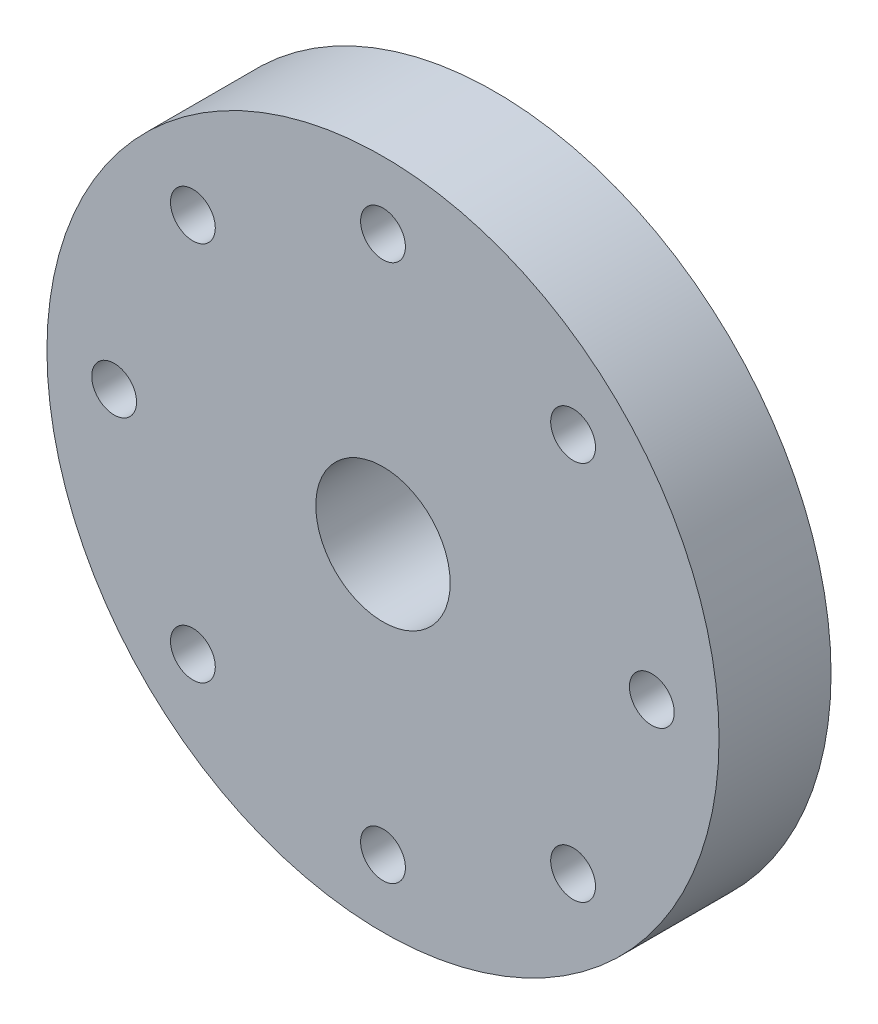
ISO-10303-21;
HEADER;
FILE_DESCRIPTION(('STEP AP214'),'2;1');
FILE_NAME('part.step','',(''),(''),'','','');
FILE_SCHEMA(('AUTOMOTIVE_DESIGN { 1 0 10303 214 1 1 1 1 }'));
ENDSEC;
DATA;
#1=APPLICATION_CONTEXT('core data for automotive mechanical design processes');
#2=APPLICATION_PROTOCOL_DEFINITION('international standard','automotive_design',2000,#1);
#3=PRODUCT_CONTEXT('',#1,'mechanical');
#4=PRODUCT('Part','Part','',(#3));
#5=PRODUCT_RELATED_PRODUCT_CATEGORY('part','',(#4));
#6=PRODUCT_DEFINITION_FORMATION('','',#4);
#7=PRODUCT_DEFINITION_CONTEXT('part definition',#1,'design');
#8=PRODUCT_DEFINITION('design','',#6,#7);
#9=PRODUCT_DEFINITION_SHAPE('','',#8);
#10=(LENGTH_UNIT() NAMED_UNIT(*) SI_UNIT(.MILLI.,.METRE.));
#11=(NAMED_UNIT(*) PLANE_ANGLE_UNIT() SI_UNIT($,.RADIAN.));
#12=(NAMED_UNIT(*) SI_UNIT($,.STERADIAN.) SOLID_ANGLE_UNIT());
#13=UNCERTAINTY_MEASURE_WITH_UNIT(LENGTH_MEASURE(1.E-05),#10,'distance_accuracy_value','');
#14=(GEOMETRIC_REPRESENTATION_CONTEXT(3) GLOBAL_UNCERTAINTY_ASSIGNED_CONTEXT((#13)) GLOBAL_UNIT_ASSIGNED_CONTEXT((#10,
#11,#12)) REPRESENTATION_CONTEXT('',''));
#15=CARTESIAN_POINT('',(0.,0.,0.));
#16=DIRECTION('',(0.,0.,1.));
#17=DIRECTION('',(1.,0.,0.));
#18=AXIS2_PLACEMENT_3D('',#15,#16,#17);
#19=CARTESIAN_POINT('',(-0.0415107906382483,-0.108617644085976,5.));
#20=DIRECTION('',(0.,0.,1.));
#21=DIRECTION('',(1.,0.,0.));
#22=AXIS2_PLACEMENT_3D('',#19,#20,#21);
#23=PLANE('',#22);
#24=CARTESIAN_POINT('',(-8.52679216487676,8.37666373015253,5.));
#25=DIRECTION('',(0.,0.,1.));
#26=DIRECTION('',(1.,0.,0.));
#27=AXIS2_PLACEMENT_3D('',#24,#25,#26);
#28=CIRCLE('',#27,0.999999999999994);
#29=CARTESIAN_POINT('',(-7.52679216487676,8.37666373015253,5.));
#30=VERTEX_POINT('',#29);
#31=EDGE_CURVE('E90',#30,#30,#28,.T.);
#32=ORIENTED_EDGE('',*,*,#31,.F.);
#33=EDGE_LOOP('',(#32));
#34=FACE_BOUND('',#33,.T.);
#35=CARTESIAN_POINT('',(-8.52679216487676,-8.59389901832462,5.));
#36=DIRECTION('',(0.,0.,1.));
#37=DIRECTION('',(1.,0.,0.));
#38=AXIS2_PLACEMENT_3D('',#35,#36,#37);
#39=CIRCLE('',#38,1.);
#40=CARTESIAN_POINT('',(-7.52679216487675,-8.59389901832462,5.));
#41=VERTEX_POINT('',#40);
#42=EDGE_CURVE('E78',#41,#41,#39,.T.);
#43=ORIENTED_EDGE('',*,*,#42,.F.);
#44=EDGE_LOOP('',(#43));
#45=FACE_BOUND('',#44,.T.);
#46=CARTESIAN_POINT('',(-0.0415107906381823,-12.108617644086,5.));
#47=DIRECTION('',(0.,0.,1.));
#48=DIRECTION('',(1.,0.,0.));
#49=AXIS2_PLACEMENT_3D('',#46,#47,#48);
#50=CIRCLE('',#49,1.);
#51=CARTESIAN_POINT('',(0.95848920936182,-12.108617644086,5.));
#52=VERTEX_POINT('',#51);
#53=EDGE_CURVE('E66',#52,#52,#50,.T.);
#54=ORIENTED_EDGE('',*,*,#53,.F.);
#55=EDGE_LOOP('',(#54));
#56=FACE_BOUND('',#55,.T.);
#57=CARTESIAN_POINT('',(8.44377058360038,8.37666373015254,5.));
#58=DIRECTION('',(0.,0.,1.));
#59=DIRECTION('',(1.,0.,0.));
#60=AXIS2_PLACEMENT_3D('',#57,#58,#59);
#61=CIRCLE('',#60,1.);
#62=CARTESIAN_POINT('',(9.44377058360039,8.37666373015254,5.));
#63=VERTEX_POINT('',#62);
#64=EDGE_CURVE('E54',#63,#63,#61,.T.);
#65=ORIENTED_EDGE('',*,*,#64,.F.);
#66=EDGE_LOOP('',(#65));
#67=FACE_BOUND('',#66,.T.);
#68=CARTESIAN_POINT('',(-0.0415107906382483,-0.108617644085976,5.));
#69=DIRECTION('',(0.,0.,1.));
#70=DIRECTION('',(1.,0.,0.));
#71=AXIS2_PLACEMENT_3D('',#68,#69,#70);
#72=CIRCLE('',#71,14.9999999999999);
#73=CARTESIAN_POINT('',(14.9584892093617,-0.108617644085976,5.));
#74=VERTEX_POINT('',#73);
#75=EDGE_CURVE('E10',#74,#74,#72,.T.);
#76=ORIENTED_EDGE('',*,*,#75,.T.);
#77=EDGE_LOOP('',(#76));
#78=FACE_BOUND('',#77,.T.);
#79=CARTESIAN_POINT('',(-0.0415107906381823,11.891382355914,5.));
#80=DIRECTION('',(0.,0.,1.));
#81=DIRECTION('',(1.,0.,0.));
#82=AXIS2_PLACEMENT_3D('',#79,#80,#81);
#83=CIRCLE('',#82,0.999999999999996);
#84=CARTESIAN_POINT('',(0.958489209361813,11.891382355914,5.));
#85=VERTEX_POINT('',#84);
#86=EDGE_CURVE('E49',#85,#85,#83,.T.);
#87=ORIENTED_EDGE('',*,*,#86,.F.);
#88=EDGE_LOOP('',(#87));
#89=FACE_BOUND('',#88,.T.);
#90=CARTESIAN_POINT('',(11.9584892093618,-0.108617664309998,5.));
#91=DIRECTION('',(0.,0.,1.));
#92=DIRECTION('',(1.,0.,0.));
#93=AXIS2_PLACEMENT_3D('',#90,#91,#92);
#94=CIRCLE('',#93,1.00000001871262);
#95=CARTESIAN_POINT('',(12.9584892280744,-0.108617664309998,5.));
#96=VERTEX_POINT('',#95);
#97=EDGE_CURVE('E60',#96,#96,#94,.T.);
#98=ORIENTED_EDGE('',*,*,#97,.F.);
#99=EDGE_LOOP('',(#98));
#100=FACE_BOUND('',#99,.T.);
#101=CARTESIAN_POINT('',(8.44377058360038,-8.59389901832461,5.));
#102=DIRECTION('',(0.,0.,1.));
#103=DIRECTION('',(1.,0.,0.));
#104=AXIS2_PLACEMENT_3D('',#101,#102,#103);
#105=CIRCLE('',#104,0.999999999999999);
#106=CARTESIAN_POINT('',(9.44377058360038,-8.59389901832461,5.));
#107=VERTEX_POINT('',#106);
#108=EDGE_CURVE('E72',#107,#107,#105,.T.);
#109=ORIENTED_EDGE('',*,*,#108,.F.);
#110=EDGE_LOOP('',(#109));
#111=FACE_BOUND('',#110,.T.);
#112=CARTESIAN_POINT('',(-12.0415107906382,-0.108617644086038,5.));
#113=DIRECTION('',(0.,0.,1.));
#114=DIRECTION('',(1.,0.,0.));
#115=AXIS2_PLACEMENT_3D('',#112,#113,#114);
#116=CIRCLE('',#115,1.);
#117=CARTESIAN_POINT('',(-11.0415107906382,-0.108617644086038,5.));
#118=VERTEX_POINT('',#117);
#119=EDGE_CURVE('E84',#118,#118,#116,.T.);
#120=ORIENTED_EDGE('',*,*,#119,.F.);
#121=EDGE_LOOP('',(#120));
#122=FACE_BOUND('',#121,.T.);
#123=CARTESIAN_POINT('',(-0.0415107906382483,-0.108617644085976,5.));
#124=DIRECTION('',(0.,0.,1.));
#125=DIRECTION('',(1.,0.,0.));
#126=AXIS2_PLACEMENT_3D('',#123,#124,#125);
#127=CIRCLE('',#126,2.99999999999995);
#128=CARTESIAN_POINT('',(2.9584892093617,-0.108617644085976,5.));
#129=VERTEX_POINT('',#128);
#130=EDGE_CURVE('E96',#129,#129,#127,.T.);
#131=ORIENTED_EDGE('',*,*,#130,.F.);
#132=EDGE_LOOP('',(#131));
#133=FACE_BOUND('',#132,.T.);
#134=ADVANCED_FACE('F38',(#34,#45,#56,#67,#78,#89,#100,#111,#122,#133),#23,.T.);
#135=CARTESIAN_POINT('',(-0.0415107906382483,-0.108617644085976,0.));
#136=DIRECTION('',(0.,0.,1.));
#137=DIRECTION('',(1.,0.,0.));
#138=AXIS2_PLACEMENT_3D('',#135,#136,#137);
#139=PLANE('',#138);
#140=CARTESIAN_POINT('',(-0.0415107906382483,-0.108617644085976,0.));
#141=DIRECTION('',(0.,0.,1.));
#142=DIRECTION('',(1.,0.,0.));
#143=AXIS2_PLACEMENT_3D('',#140,#141,#142);
#144=CIRCLE('',#143,14.9999999999999);
#145=CARTESIAN_POINT('',(14.9584892093617,-0.108617644085976,0.));
#146=VERTEX_POINT('',#145);
#147=EDGE_CURVE('E42',#146,#146,#144,.T.);
#148=ORIENTED_EDGE('',*,*,#147,.F.);
#149=EDGE_LOOP('',(#148));
#150=FACE_BOUND('',#149,.T.);
#151=CARTESIAN_POINT('',(-0.0415107906381823,11.891382355914,0.));
#152=DIRECTION('',(0.,0.,1.));
#153=DIRECTION('',(1.,0.,0.));
#154=AXIS2_PLACEMENT_3D('',#151,#152,#153);
#155=CIRCLE('',#154,0.999999999999996);
#156=CARTESIAN_POINT('',(0.958489209361813,11.891382355914,0.));
#157=VERTEX_POINT('',#156);
#158=EDGE_CURVE('E51',#157,#157,#155,.T.);
#159=ORIENTED_EDGE('',*,*,#158,.T.);
#160=EDGE_LOOP('',(#159));
#161=FACE_BOUND('',#160,.T.);
#162=CARTESIAN_POINT('',(8.44377058360038,8.37666373015254,0.));
#163=DIRECTION('',(0.,0.,1.));
#164=DIRECTION('',(1.,0.,0.));
#165=AXIS2_PLACEMENT_3D('',#162,#163,#164);
#166=CIRCLE('',#165,1.);
#167=CARTESIAN_POINT('',(9.44377058360039,8.37666373015254,0.));
#168=VERTEX_POINT('',#167);
#169=EDGE_CURVE('E57',#168,#168,#166,.T.);
#170=ORIENTED_EDGE('',*,*,#169,.T.);
#171=EDGE_LOOP('',(#170));
#172=FACE_BOUND('',#171,.T.);
#173=CARTESIAN_POINT('',(11.9584892093618,-0.108617664309998,0.));
#174=DIRECTION('',(0.,0.,1.));
#175=DIRECTION('',(1.,0.,0.));
#176=AXIS2_PLACEMENT_3D('',#173,#174,#175);
#177=CIRCLE('',#176,1.00000001871262);
#178=CARTESIAN_POINT('',(12.9584892280744,-0.108617664309998,0.));
#179=VERTEX_POINT('',#178);
#180=EDGE_CURVE('E63',#179,#179,#177,.T.);
#181=ORIENTED_EDGE('',*,*,#180,.T.);
#182=EDGE_LOOP('',(#181));
#183=FACE_BOUND('',#182,.T.);
#184=CARTESIAN_POINT('',(-0.0415107906381823,-12.108617644086,0.));
#185=DIRECTION('',(0.,0.,1.));
#186=DIRECTION('',(1.,0.,0.));
#187=AXIS2_PLACEMENT_3D('',#184,#185,#186);
#188=CIRCLE('',#187,1.);
#189=CARTESIAN_POINT('',(0.95848920936182,-12.108617644086,0.));
#190=VERTEX_POINT('',#189);
#191=EDGE_CURVE('E69',#190,#190,#188,.T.);
#192=ORIENTED_EDGE('',*,*,#191,.T.);
#193=EDGE_LOOP('',(#192));
#194=FACE_BOUND('',#193,.T.);
#195=CARTESIAN_POINT('',(8.44377058360038,-8.59389901832461,0.));
#196=DIRECTION('',(0.,0.,1.));
#197=DIRECTION('',(1.,0.,0.));
#198=AXIS2_PLACEMENT_3D('',#195,#196,#197);
#199=CIRCLE('',#198,0.999999999999999);
#200=CARTESIAN_POINT('',(9.44377058360038,-8.59389901832461,0.));
#201=VERTEX_POINT('',#200);
#202=EDGE_CURVE('E75',#201,#201,#199,.T.);
#203=ORIENTED_EDGE('',*,*,#202,.T.);
#204=EDGE_LOOP('',(#203));
#205=FACE_BOUND('',#204,.T.);
#206=CARTESIAN_POINT('',(-8.52679216487676,-8.59389901832462,0.));
#207=DIRECTION('',(0.,0.,1.));
#208=DIRECTION('',(1.,0.,0.));
#209=AXIS2_PLACEMENT_3D('',#206,#207,#208);
#210=CIRCLE('',#209,1.);
#211=CARTESIAN_POINT('',(-7.52679216487675,-8.59389901832462,0.));
#212=VERTEX_POINT('',#211);
#213=EDGE_CURVE('E81',#212,#212,#210,.T.);
#214=ORIENTED_EDGE('',*,*,#213,.T.);
#215=EDGE_LOOP('',(#214));
#216=FACE_BOUND('',#215,.T.);
#217=CARTESIAN_POINT('',(-12.0415107906382,-0.108617644086038,0.));
#218=DIRECTION('',(0.,0.,1.));
#219=DIRECTION('',(1.,0.,0.));
#220=AXIS2_PLACEMENT_3D('',#217,#218,#219);
#221=CIRCLE('',#220,1.);
#222=CARTESIAN_POINT('',(-11.0415107906382,-0.108617644086038,0.));
#223=VERTEX_POINT('',#222);
#224=EDGE_CURVE('E87',#223,#223,#221,.T.);
#225=ORIENTED_EDGE('',*,*,#224,.T.);
#226=EDGE_LOOP('',(#225));
#227=FACE_BOUND('',#226,.T.);
#228=CARTESIAN_POINT('',(-8.52679216487676,8.37666373015253,0.));
#229=DIRECTION('',(0.,0.,1.));
#230=DIRECTION('',(1.,0.,0.));
#231=AXIS2_PLACEMENT_3D('',#228,#229,#230);
#232=CIRCLE('',#231,0.999999999999994);
#233=CARTESIAN_POINT('',(-7.52679216487676,8.37666373015253,0.));
#234=VERTEX_POINT('',#233);
#235=EDGE_CURVE('E93',#234,#234,#232,.T.);
#236=ORIENTED_EDGE('',*,*,#235,.T.);
#237=EDGE_LOOP('',(#236));
#238=FACE_BOUND('',#237,.T.);
#239=CARTESIAN_POINT('',(-0.0415107906382483,-0.108617644085976,0.));
#240=DIRECTION('',(0.,0.,1.));
#241=DIRECTION('',(1.,0.,0.));
#242=AXIS2_PLACEMENT_3D('',#239,#240,#241);
#243=CIRCLE('',#242,2.99999999999995);
#244=CARTESIAN_POINT('',(2.9584892093617,-0.108617644085976,0.));
#245=VERTEX_POINT('',#244);
#246=EDGE_CURVE('E99',#245,#245,#243,.T.);
#247=ORIENTED_EDGE('',*,*,#246,.T.);
#248=EDGE_LOOP('',(#247));
#249=FACE_BOUND('',#248,.T.);
#250=ADVANCED_FACE('F109',(#150,#161,#172,#183,#194,#205,#216,#227,#238,#249),#139,.F.);
#251=CARTESIAN_POINT('',(-0.0415107906382483,-0.108617644085976,5.));
#252=DIRECTION('',(0.,0.,-1.));
#253=DIRECTION('',(-1.,0.,0.));
#254=AXIS2_PLACEMENT_3D('',#251,#252,#253);
#255=CYLINDRICAL_SURFACE('',#254,14.9999999999999);
#256=ORIENTED_EDGE('',*,*,#75,.F.);
#257=EDGE_LOOP('',(#256));
#258=FACE_BOUND('',#257,.T.);
#259=ORIENTED_EDGE('',*,*,#147,.T.);
#260=EDGE_LOOP('',(#259));
#261=FACE_BOUND('',#260,.T.);
#262=ADVANCED_FACE('F40',(#258,#261),#255,.T.);
#263=CARTESIAN_POINT('',(-0.0415107906381823,11.891382355914,5.));
#264=DIRECTION('',(0.,0.,-1.));
#265=DIRECTION('',(-1.,0.,0.));
#266=AXIS2_PLACEMENT_3D('',#263,#264,#265);
#267=CYLINDRICAL_SURFACE('',#266,0.999999999999996);
#268=ORIENTED_EDGE('',*,*,#86,.T.);
#269=EDGE_LOOP('',(#268));
#270=FACE_BOUND('',#269,.T.);
#271=ORIENTED_EDGE('',*,*,#158,.F.);
#272=EDGE_LOOP('',(#271));
#273=FACE_BOUND('',#272,.T.);
#274=ADVANCED_FACE('F119',(#270,#273),#267,.F.);
#275=CARTESIAN_POINT('',(8.44377058360038,8.37666373015254,5.));
#276=DIRECTION('',(0.,0.,-1.));
#277=DIRECTION('',(-1.,0.,0.));
#278=AXIS2_PLACEMENT_3D('',#275,#276,#277);
#279=CYLINDRICAL_SURFACE('',#278,1.);
#280=ORIENTED_EDGE('',*,*,#64,.T.);
#281=EDGE_LOOP('',(#280));
#282=FACE_BOUND('',#281,.T.);
#283=ORIENTED_EDGE('',*,*,#169,.F.);
#284=EDGE_LOOP('',(#283));
#285=FACE_BOUND('',#284,.T.);
#286=ADVANCED_FACE('F122',(#282,#285),#279,.F.);
#287=CARTESIAN_POINT('',(11.9584892093618,-0.108617664309998,5.));
#288=DIRECTION('',(0.,0.,-1.));
#289=DIRECTION('',(-1.,0.,0.));
#290=AXIS2_PLACEMENT_3D('',#287,#288,#289);
#291=CYLINDRICAL_SURFACE('',#290,1.00000001871262);
#292=ORIENTED_EDGE('',*,*,#97,.T.);
#293=EDGE_LOOP('',(#292));
#294=FACE_BOUND('',#293,.T.);
#295=ORIENTED_EDGE('',*,*,#180,.F.);
#296=EDGE_LOOP('',(#295));
#297=FACE_BOUND('',#296,.T.);
#298=ADVANCED_FACE('F126',(#294,#297),#291,.F.);
#299=CARTESIAN_POINT('',(-0.0415107906381823,-12.108617644086,5.));
#300=DIRECTION('',(0.,0.,-1.));
#301=DIRECTION('',(-1.,0.,0.));
#302=AXIS2_PLACEMENT_3D('',#299,#300,#301);
#303=CYLINDRICAL_SURFACE('',#302,1.);
#304=ORIENTED_EDGE('',*,*,#53,.T.);
#305=EDGE_LOOP('',(#304));
#306=FACE_BOUND('',#305,.T.);
#307=ORIENTED_EDGE('',*,*,#191,.F.);
#308=EDGE_LOOP('',(#307));
#309=FACE_BOUND('',#308,.T.);
#310=ADVANCED_FACE('F130',(#306,#309),#303,.F.);
#311=CARTESIAN_POINT('',(8.44377058360038,-8.59389901832461,5.));
#312=DIRECTION('',(0.,0.,-1.));
#313=DIRECTION('',(-1.,0.,0.));
#314=AXIS2_PLACEMENT_3D('',#311,#312,#313);
#315=CYLINDRICAL_SURFACE('',#314,0.999999999999999);
#316=ORIENTED_EDGE('',*,*,#108,.T.);
#317=EDGE_LOOP('',(#316));
#318=FACE_BOUND('',#317,.T.);
#319=ORIENTED_EDGE('',*,*,#202,.F.);
#320=EDGE_LOOP('',(#319));
#321=FACE_BOUND('',#320,.T.);
#322=ADVANCED_FACE('F134',(#318,#321),#315,.F.);
#323=CARTESIAN_POINT('',(-8.52679216487676,-8.59389901832462,5.));
#324=DIRECTION('',(0.,0.,-1.));
#325=DIRECTION('',(-1.,0.,0.));
#326=AXIS2_PLACEMENT_3D('',#323,#324,#325);
#327=CYLINDRICAL_SURFACE('',#326,1.);
#328=ORIENTED_EDGE('',*,*,#42,.T.);
#329=EDGE_LOOP('',(#328));
#330=FACE_BOUND('',#329,.T.);
#331=ORIENTED_EDGE('',*,*,#213,.F.);
#332=EDGE_LOOP('',(#331));
#333=FACE_BOUND('',#332,.T.);
#334=ADVANCED_FACE('F138',(#330,#333),#327,.F.);
#335=CARTESIAN_POINT('',(-12.0415107906382,-0.108617644086038,5.));
#336=DIRECTION('',(0.,0.,-1.));
#337=DIRECTION('',(-1.,0.,0.));
#338=AXIS2_PLACEMENT_3D('',#335,#336,#337);
#339=CYLINDRICAL_SURFACE('',#338,1.);
#340=ORIENTED_EDGE('',*,*,#119,.T.);
#341=EDGE_LOOP('',(#340));
#342=FACE_BOUND('',#341,.T.);
#343=ORIENTED_EDGE('',*,*,#224,.F.);
#344=EDGE_LOOP('',(#343));
#345=FACE_BOUND('',#344,.T.);
#346=ADVANCED_FACE('F142',(#342,#345),#339,.F.);
#347=CARTESIAN_POINT('',(-8.52679216487676,8.37666373015253,5.));
#348=DIRECTION('',(0.,0.,-1.));
#349=DIRECTION('',(-1.,0.,0.));
#350=AXIS2_PLACEMENT_3D('',#347,#348,#349);
#351=CYLINDRICAL_SURFACE('',#350,0.999999999999994);
#352=ORIENTED_EDGE('',*,*,#31,.T.);
#353=EDGE_LOOP('',(#352));
#354=FACE_BOUND('',#353,.T.);
#355=ORIENTED_EDGE('',*,*,#235,.F.);
#356=EDGE_LOOP('',(#355));
#357=FACE_BOUND('',#356,.T.);
#358=ADVANCED_FACE('F146',(#354,#357),#351,.F.);
#359=CARTESIAN_POINT('',(-0.0415107906382483,-0.108617644085976,5.));
#360=DIRECTION('',(0.,0.,-1.));
#361=DIRECTION('',(-1.,0.,0.));
#362=AXIS2_PLACEMENT_3D('',#359,#360,#361);
#363=CYLINDRICAL_SURFACE('',#362,2.99999999999995);
#364=ORIENTED_EDGE('',*,*,#130,.T.);
#365=EDGE_LOOP('',(#364));
#366=FACE_BOUND('',#365,.T.);
#367=ORIENTED_EDGE('',*,*,#246,.F.);
#368=EDGE_LOOP('',(#367));
#369=FACE_BOUND('',#368,.T.);
#370=ADVANCED_FACE('F105',(#366,#369),#363,.F.);
#371=CLOSED_SHELL('',(#134,#250,#262,#274,#286,#298,#310,#322,#334,#346,#358,#370));
#372=MANIFOLD_SOLID_BREP('B2',#371);
#373=ADVANCED_BREP_SHAPE_REPRESENTATION('',(#18,#372),#14);
#374=SHAPE_DEFINITION_REPRESENTATION(#9,#373);
ENDSEC;
END-ISO-10303-21;
